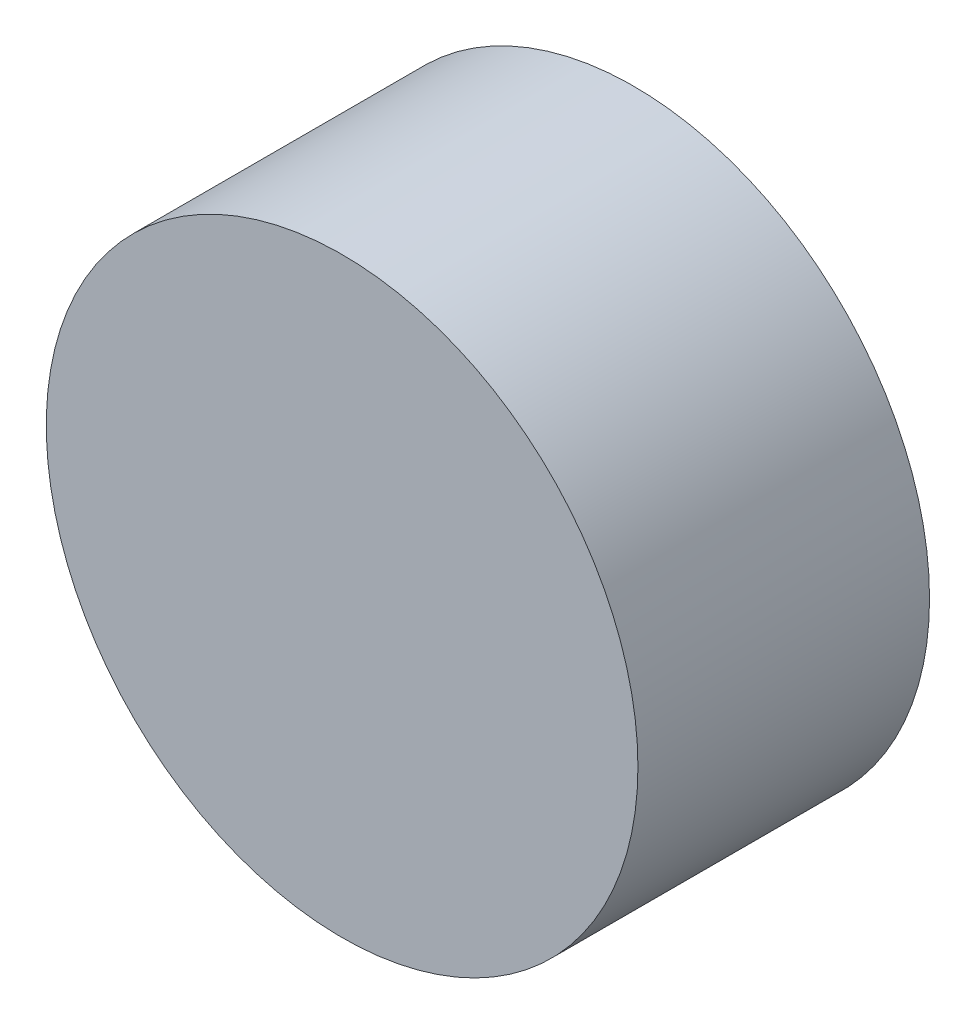
ISO-10303-21;
HEADER;
FILE_DESCRIPTION(('STEP AP214'),'2;1');
FILE_NAME('part.step','',(''),(''),'','','');
FILE_SCHEMA(('AUTOMOTIVE_DESIGN { 1 0 10303 214 1 1 1 1 }'));
ENDSEC;
DATA;
#1=APPLICATION_CONTEXT('core data for automotive mechanical design processes');
#2=APPLICATION_PROTOCOL_DEFINITION('international standard','automotive_design',2000,#1);
#3=PRODUCT_CONTEXT('',#1,'mechanical');
#4=PRODUCT('Part','Part','',(#3));
#5=PRODUCT_RELATED_PRODUCT_CATEGORY('part','',(#4));
#6=PRODUCT_DEFINITION_FORMATION('','',#4);
#7=PRODUCT_DEFINITION_CONTEXT('part definition',#1,'design');
#8=PRODUCT_DEFINITION('design','',#6,#7);
#9=PRODUCT_DEFINITION_SHAPE('','',#8);
#10=(LENGTH_UNIT() NAMED_UNIT(*) SI_UNIT(.MILLI.,.METRE.));
#11=(NAMED_UNIT(*) PLANE_ANGLE_UNIT() SI_UNIT($,.RADIAN.));
#12=(NAMED_UNIT(*) SI_UNIT($,.STERADIAN.) SOLID_ANGLE_UNIT());
#13=UNCERTAINTY_MEASURE_WITH_UNIT(LENGTH_MEASURE(1.E-05),#10,'distance_accuracy_value','');
#14=(GEOMETRIC_REPRESENTATION_CONTEXT(3) GLOBAL_UNCERTAINTY_ASSIGNED_CONTEXT((#13)) GLOBAL_UNIT_ASSIGNED_CONTEXT((#10,
#11,#12)) REPRESENTATION_CONTEXT('',''));
#15=CARTESIAN_POINT('',(0.,0.,0.));
#16=DIRECTION('',(0.,0.,1.));
#17=DIRECTION('',(1.,0.,0.));
#18=AXIS2_PLACEMENT_3D('',#15,#16,#17);
#19=CARTESIAN_POINT('',(0.,0.,1.38));
#20=DIRECTION('',(0.,0.,-1.));
#21=DIRECTION('',(-1.,0.,0.));
#22=AXIS2_PLACEMENT_3D('',#19,#20,#21);
#23=CYLINDRICAL_SURFACE('',#22,1.4);
#24=CARTESIAN_POINT('',(0.,0.,1.38));
#25=DIRECTION('',(0.,0.,1.));
#26=DIRECTION('',(1.,0.,0.));
#27=AXIS2_PLACEMENT_3D('',#24,#25,#26);
#28=CIRCLE('',#27,1.4);
#29=CARTESIAN_POINT('',(1.4,0.,1.38));
#30=VERTEX_POINT('',#29);
#31=EDGE_CURVE('E10',#30,#30,#28,.T.);
#32=ORIENTED_EDGE('',*,*,#31,.F.);
#33=EDGE_LOOP('',(#32));
#34=FACE_BOUND('',#33,.T.);
#35=CARTESIAN_POINT('',(0.,0.,0.));
#36=DIRECTION('',(0.,0.,1.));
#37=DIRECTION('',(1.,0.,0.));
#38=AXIS2_PLACEMENT_3D('',#35,#36,#37);
#39=CIRCLE('',#38,1.4);
#40=CARTESIAN_POINT('',(1.4,0.,0.));
#41=VERTEX_POINT('',#40);
#42=EDGE_CURVE('E37',#41,#41,#39,.T.);
#43=ORIENTED_EDGE('',*,*,#42,.T.);
#44=EDGE_LOOP('',(#43));
#45=FACE_BOUND('',#44,.T.);
#46=ADVANCED_FACE('F40',(#34,#45),#23,.T.);
#47=CARTESIAN_POINT('',(0.,0.,1.38));
#48=DIRECTION('',(0.,0.,1.));
#49=DIRECTION('',(1.,0.,0.));
#50=AXIS2_PLACEMENT_3D('',#47,#48,#49);
#51=PLANE('',#50);
#52=ORIENTED_EDGE('',*,*,#31,.T.);
#53=EDGE_LOOP('',(#52));
#54=FACE_BOUND('',#53,.T.);
#55=ADVANCED_FACE('F55',(#54),#51,.T.);
#56=CARTESIAN_POINT('',(0.,0.,0.));
#57=DIRECTION('',(0.,0.,1.));
#58=DIRECTION('',(1.,0.,0.));
#59=AXIS2_PLACEMENT_3D('',#56,#57,#58);
#60=PLANE('',#59);
#61=ORIENTED_EDGE('',*,*,#42,.F.);
#62=EDGE_LOOP('',(#61));
#63=FACE_BOUND('',#62,.T.);
#64=ADVANCED_FACE('F49',(#63),#60,.F.);
#65=CLOSED_SHELL('',(#46,#55,#64));
#66=MANIFOLD_SOLID_BREP('B2',#65);
#67=ADVANCED_BREP_SHAPE_REPRESENTATION('',(#18,#66),#14);
#68=SHAPE_DEFINITION_REPRESENTATION(#9,#67);
ENDSEC;
END-ISO-10303-21;
